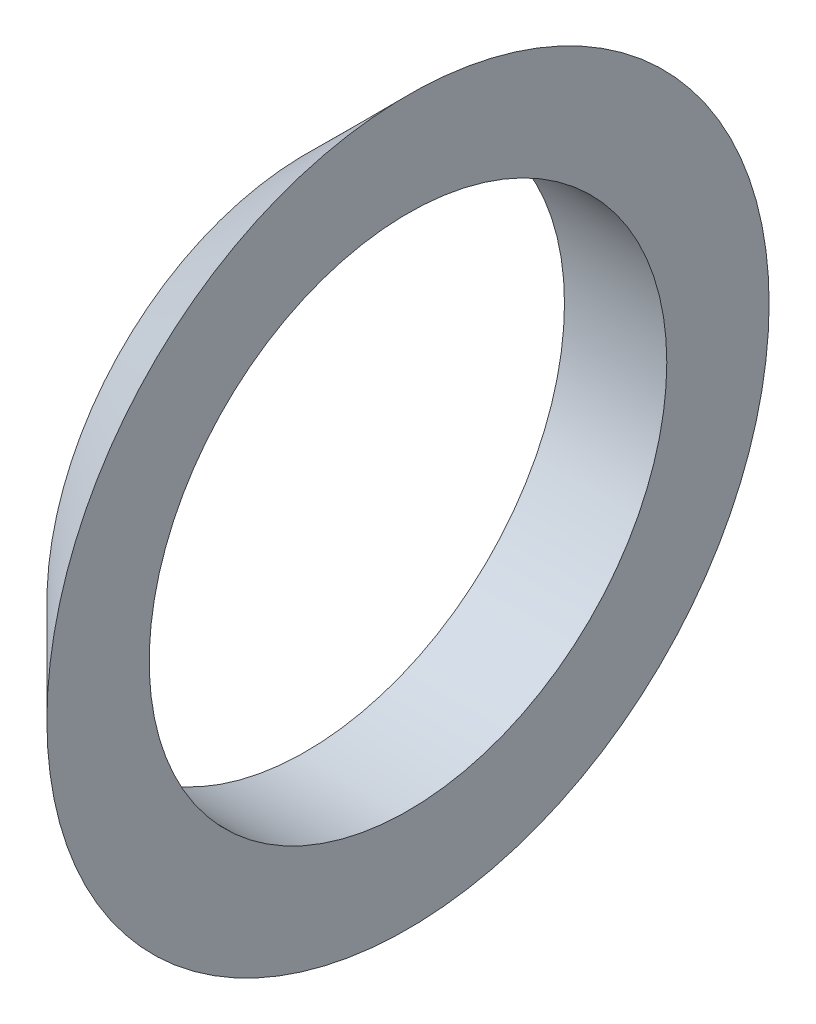
ISO-10303-21;
HEADER;
FILE_DESCRIPTION(('STEP AP214'),'2;1');
FILE_NAME('part.step','',(''),(''),'','','');
FILE_SCHEMA(('AUTOMOTIVE_DESIGN { 1 0 10303 214 1 1 1 1 }'));
ENDSEC;
DATA;
#1=APPLICATION_CONTEXT('core data for automotive mechanical design processes');
#2=APPLICATION_PROTOCOL_DEFINITION('international standard','automotive_design',2000,#1);
#3=PRODUCT_CONTEXT('',#1,'mechanical');
#4=PRODUCT('Part','Part','',(#3));
#5=PRODUCT_RELATED_PRODUCT_CATEGORY('part','',(#4));
#6=PRODUCT_DEFINITION_FORMATION('','',#4);
#7=PRODUCT_DEFINITION_CONTEXT('part definition',#1,'design');
#8=PRODUCT_DEFINITION('design','',#6,#7);
#9=PRODUCT_DEFINITION_SHAPE('','',#8);
#10=(LENGTH_UNIT() NAMED_UNIT(*) SI_UNIT(.MILLI.,.METRE.));
#11=(NAMED_UNIT(*) PLANE_ANGLE_UNIT() SI_UNIT($,.RADIAN.));
#12=(NAMED_UNIT(*) SI_UNIT($,.STERADIAN.) SOLID_ANGLE_UNIT());
#13=UNCERTAINTY_MEASURE_WITH_UNIT(LENGTH_MEASURE(1.E-05),#10,'distance_accuracy_value','');
#14=(GEOMETRIC_REPRESENTATION_CONTEXT(3) GLOBAL_UNCERTAINTY_ASSIGNED_CONTEXT((#13)) GLOBAL_UNIT_ASSIGNED_CONTEXT((#10,
#11,#12)) REPRESENTATION_CONTEXT('',''));
#15=CARTESIAN_POINT('',(0.,0.,0.));
#16=DIRECTION('',(0.,0.,1.));
#17=DIRECTION('',(1.,0.,0.));
#18=AXIS2_PLACEMENT_3D('',#15,#16,#17);
#19=CARTESIAN_POINT('',(-21.59,0.,0.));
#20=DIRECTION('',(1.,0.,0.));
#21=DIRECTION('',(0.,0.,-1.));
#22=AXIS2_PLACEMENT_3D('',#19,#20,#21);
#23=CONICAL_SURFACE('',#22,54.61,0.785398163397449);
#24=CARTESIAN_POINT('',(0.,0.,0.));
#25=DIRECTION('',(1.,0.,0.));
#26=DIRECTION('',(0.,0.,-1.));
#27=AXIS2_PLACEMENT_3D('',#24,#25,#26);
#28=CIRCLE('',#27,76.2);
#29=CARTESIAN_POINT('',(0.,0.,-76.2));
#30=VERTEX_POINT('',#29);
#31=EDGE_CURVE('E10',#30,#30,#28,.T.);
#32=ORIENTED_EDGE('',*,*,#31,.F.);
#33=EDGE_LOOP('',(#32));
#34=FACE_BOUND('',#33,.T.);
#35=CARTESIAN_POINT('',(-21.59,0.,0.));
#36=DIRECTION('',(1.,0.,0.));
#37=DIRECTION('',(0.,0.,-1.));
#38=AXIS2_PLACEMENT_3D('',#35,#36,#37);
#39=CIRCLE('',#38,54.61);
#40=CARTESIAN_POINT('',(-21.59,0.,-54.61));
#41=VERTEX_POINT('',#40);
#42=EDGE_CURVE('E49',#41,#41,#39,.T.);
#43=ORIENTED_EDGE('',*,*,#42,.T.);
#44=EDGE_LOOP('',(#43));
#45=FACE_BOUND('',#44,.T.);
#46=ADVANCED_FACE('F39',(#34,#45),#23,.T.);
#47=CARTESIAN_POINT('',(0.,-76.2,0.));
#48=DIRECTION('',(-1.,0.,0.));
#49=DIRECTION('',(0.,0.,1.));
#50=AXIS2_PLACEMENT_3D('',#47,#48,#49);
#51=PLANE('',#50);
#52=CARTESIAN_POINT('',(0.,0.,0.));
#53=DIRECTION('',(1.,0.,0.));
#54=DIRECTION('',(0.,0.,-1.));
#55=AXIS2_PLACEMENT_3D('',#52,#53,#54);
#56=CIRCLE('',#55,54.61);
#57=CARTESIAN_POINT('',(0.,0.,-54.61));
#58=VERTEX_POINT('',#57);
#59=EDGE_CURVE('E45',#58,#58,#56,.T.);
#60=ORIENTED_EDGE('',*,*,#59,.F.);
#61=EDGE_LOOP('',(#60));
#62=FACE_BOUND('',#61,.T.);
#63=ORIENTED_EDGE('',*,*,#31,.T.);
#64=EDGE_LOOP('',(#63));
#65=FACE_BOUND('',#64,.T.);
#66=ADVANCED_FACE('F59',(#62,#65),#51,.F.);
#67=CARTESIAN_POINT('',(0.,0.,0.));
#68=DIRECTION('',(1.,0.,0.));
#69=DIRECTION('',(0.,0.,-1.));
#70=AXIS2_PLACEMENT_3D('',#67,#68,#69);
#71=CYLINDRICAL_SURFACE('',#70,54.61);
#72=ORIENTED_EDGE('',*,*,#42,.F.);
#73=EDGE_LOOP('',(#72));
#74=FACE_BOUND('',#73,.T.);
#75=ORIENTED_EDGE('',*,*,#59,.T.);
#76=EDGE_LOOP('',(#75));
#77=FACE_BOUND('',#76,.T.);
#78=ADVANCED_FACE('F57',(#74,#77),#71,.F.);
#79=CLOSED_SHELL('',(#46,#66,#78));
#80=MANIFOLD_SOLID_BREP('B2',#79);
#81=ADVANCED_BREP_SHAPE_REPRESENTATION('',(#18,#80),#14);
#82=SHAPE_DEFINITION_REPRESENTATION(#9,#81);
ENDSEC;
END-ISO-10303-21;
